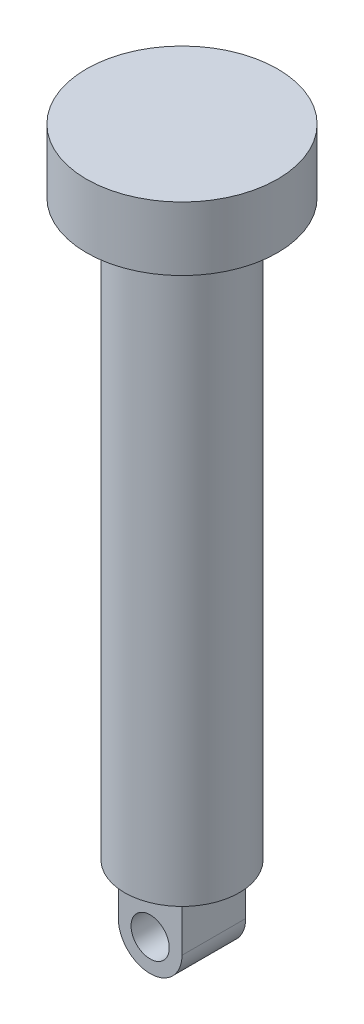
ISO-10303-21;
HEADER;
FILE_DESCRIPTION(('STEP AP214'),'2;1');
FILE_NAME('part.step','',(''),(''),'','','');
FILE_SCHEMA(('AUTOMOTIVE_DESIGN { 1 0 10303 214 1 1 1 1 }'));
ENDSEC;
DATA;
#1=APPLICATION_CONTEXT('core data for automotive mechanical design processes');
#2=APPLICATION_PROTOCOL_DEFINITION('international standard','automotive_design',2000,#1);
#3=PRODUCT_CONTEXT('',#1,'mechanical');
#4=PRODUCT('Part','Part','',(#3));
#5=PRODUCT_RELATED_PRODUCT_CATEGORY('part','',(#4));
#6=PRODUCT_DEFINITION_FORMATION('','',#4);
#7=PRODUCT_DEFINITION_CONTEXT('part definition',#1,'design');
#8=PRODUCT_DEFINITION('design','',#6,#7);
#9=PRODUCT_DEFINITION_SHAPE('','',#8);
#10=(LENGTH_UNIT() NAMED_UNIT(*) SI_UNIT(.MILLI.,.METRE.));
#11=(NAMED_UNIT(*) PLANE_ANGLE_UNIT() SI_UNIT($,.RADIAN.));
#12=(NAMED_UNIT(*) SI_UNIT($,.STERADIAN.) SOLID_ANGLE_UNIT());
#13=UNCERTAINTY_MEASURE_WITH_UNIT(LENGTH_MEASURE(1.E-05),#10,'distance_accuracy_value','');
#14=(GEOMETRIC_REPRESENTATION_CONTEXT(3) GLOBAL_UNCERTAINTY_ASSIGNED_CONTEXT((#13)) GLOBAL_UNIT_ASSIGNED_CONTEXT((#10,
#11,#12)) REPRESENTATION_CONTEXT('',''));
#15=CARTESIAN_POINT('',(0.,0.,0.));
#16=DIRECTION('',(0.,0.,1.));
#17=DIRECTION('',(1.,0.,0.));
#18=AXIS2_PLACEMENT_3D('',#15,#16,#17);
#19=CARTESIAN_POINT('',(0.,-90.,0.));
#20=DIRECTION('',(0.,1.,0.));
#21=DIRECTION('',(0.,0.,1.));
#22=AXIS2_PLACEMENT_3D('',#19,#20,#21);
#23=PLANE('',#22);
#24=CARTESIAN_POINT('',(0.,-90.,0.));
#25=DIRECTION('',(0.,1.,0.));
#26=DIRECTION('',(0.,0.,1.));
#27=AXIS2_PLACEMENT_3D('',#24,#25,#26);
#28=CIRCLE('',#27,9.);
#29=CARTESIAN_POINT('',(0.,-90.,9.));
#30=VERTEX_POINT('',#29);
#31=EDGE_CURVE('E120',#30,#30,#28,.T.);
#32=ORIENTED_EDGE('',*,*,#31,.F.);
#33=EDGE_LOOP('',(#32));
#34=FACE_BOUND('',#33,.T.);
#35=DIRECTION('',(0.,0.,-1.));
#36=VECTOR('',#35,1.);
#37=CARTESIAN_POINT('',(-5.,-90.,5.));
#38=LINE('',#37,#36);
#39=CARTESIAN_POINT('',(-5.,-90.,5.));
#40=VERTEX_POINT('',#39);
#41=CARTESIAN_POINT('',(-5.,-90.,-5.));
#42=VERTEX_POINT('',#41);
#43=EDGE_CURVE('E56',#40,#42,#38,.T.);
#44=ORIENTED_EDGE('',*,*,#43,.F.);
#45=DIRECTION('',(-1.,0.,0.));
#46=VECTOR('',#45,1.);
#47=CARTESIAN_POINT('',(-5.,-90.,5.));
#48=LINE('',#47,#46);
#49=CARTESIAN_POINT('',(5.,-90.,5.));
#50=VERTEX_POINT('',#49);
#51=EDGE_CURVE('E88',#50,#40,#48,.T.);
#52=ORIENTED_EDGE('',*,*,#51,.F.);
#53=DIRECTION('',(0.,0.,-1.));
#54=VECTOR('',#53,1.);
#55=CARTESIAN_POINT('',(5.,-90.,5.));
#56=LINE('',#55,#54);
#57=CARTESIAN_POINT('',(5.,-90.,-5.));
#58=VERTEX_POINT('',#57);
#59=EDGE_CURVE('E104',#50,#58,#56,.T.);
#60=ORIENTED_EDGE('',*,*,#59,.T.);
#61=DIRECTION('',(-1.,0.,0.));
#62=VECTOR('',#61,1.);
#63=CARTESIAN_POINT('',(-5.,-90.,-5.));
#64=LINE('',#63,#62);
#65=EDGE_CURVE('E61',#58,#42,#64,.T.);
#66=ORIENTED_EDGE('',*,*,#65,.T.);
#67=EDGE_LOOP('',(#44,#52,#60,#66));
#68=FACE_BOUND('',#67,.T.);
#69=ADVANCED_FACE('F41',(#34,#68),#23,.F.);
#70=CARTESIAN_POINT('',(0.,10.,0.));
#71=DIRECTION('',(0.,-1.,0.));
#72=DIRECTION('',(0.,0.,-1.));
#73=AXIS2_PLACEMENT_3D('',#70,#71,#72);
#74=CYLINDRICAL_SURFACE('',#73,15.);
#75=CARTESIAN_POINT('',(0.,10.,0.));
#76=DIRECTION('',(0.,1.,0.));
#77=DIRECTION('',(0.,0.,1.));
#78=AXIS2_PLACEMENT_3D('',#75,#76,#77);
#79=CIRCLE('',#78,15.);
#80=CARTESIAN_POINT('',(0.,10.,15.));
#81=VERTEX_POINT('',#80);
#82=EDGE_CURVE('E11',#81,#81,#79,.T.);
#83=ORIENTED_EDGE('',*,*,#82,.F.);
#84=EDGE_LOOP('',(#83));
#85=FACE_BOUND('',#84,.T.);
#86=CARTESIAN_POINT('',(0.,0.,0.));
#87=DIRECTION('',(0.,1.,0.));
#88=DIRECTION('',(0.,0.,1.));
#89=AXIS2_PLACEMENT_3D('',#86,#87,#88);
#90=CIRCLE('',#89,15.);
#91=CARTESIAN_POINT('',(0.,0.,15.));
#92=VERTEX_POINT('',#91);
#93=EDGE_CURVE('E45',#92,#92,#90,.T.);
#94=ORIENTED_EDGE('',*,*,#93,.T.);
#95=EDGE_LOOP('',(#94));
#96=FACE_BOUND('',#95,.T.);
#97=ADVANCED_FACE('F43',(#85,#96),#74,.T.);
#98=CARTESIAN_POINT('',(0.,10.,0.));
#99=DIRECTION('',(0.,1.,0.));
#100=DIRECTION('',(0.,0.,1.));
#101=AXIS2_PLACEMENT_3D('',#98,#99,#100);
#102=PLANE('',#101);
#103=ORIENTED_EDGE('',*,*,#82,.T.);
#104=EDGE_LOOP('',(#103));
#105=FACE_BOUND('',#104,.T.);
#106=ADVANCED_FACE('F140',(#105),#102,.T.);
#107=CARTESIAN_POINT('',(0.,0.,0.));
#108=DIRECTION('',(0.,1.,0.));
#109=DIRECTION('',(0.,0.,1.));
#110=AXIS2_PLACEMENT_3D('',#107,#108,#109);
#111=PLANE('',#110);
#112=CARTESIAN_POINT('',(0.,0.,0.));
#113=DIRECTION('',(0.,1.,0.));
#114=DIRECTION('',(0.,0.,1.));
#115=AXIS2_PLACEMENT_3D('',#112,#113,#114);
#116=CIRCLE('',#115,9.);
#117=CARTESIAN_POINT('',(0.,0.,9.));
#118=VERTEX_POINT('',#117);
#119=EDGE_CURVE('E119',#118,#118,#116,.T.);
#120=ORIENTED_EDGE('',*,*,#119,.T.);
#121=EDGE_LOOP('',(#120));
#122=FACE_BOUND('',#121,.T.);
#123=ORIENTED_EDGE('',*,*,#93,.F.);
#124=EDGE_LOOP('',(#123));
#125=FACE_BOUND('',#124,.T.);
#126=ADVANCED_FACE('F126',(#122,#125),#111,.F.);
#127=CARTESIAN_POINT('',(0.,-90.,0.));
#128=DIRECTION('',(0.,1.,0.));
#129=DIRECTION('',(0.,0.,1.));
#130=AXIS2_PLACEMENT_3D('',#127,#128,#129);
#131=CYLINDRICAL_SURFACE('',#130,9.);
#132=CARTESIAN_POINT('',(0.,-90.,9.));
#133=CARTESIAN_POINT('',(0.,-89.0625,9.));
#134=CARTESIAN_POINT('',(0.,-88.125,9.));
#135=CARTESIAN_POINT('',(0.,-86.25,9.));
#136=CARTESIAN_POINT('',(0.,-85.3125,9.));
#137=CARTESIAN_POINT('',(0.,-83.4375,9.));
#138=CARTESIAN_POINT('',(0.,-82.5,9.));
#139=CARTESIAN_POINT('',(0.,-80.625,9.));
#140=CARTESIAN_POINT('',(0.,-79.6875,9.));
#141=CARTESIAN_POINT('',(0.,-77.8125,9.));
#142=CARTESIAN_POINT('',(0.,-76.875,9.));
#143=CARTESIAN_POINT('',(0.,-75.,9.));
#144=CARTESIAN_POINT('',(0.,-74.0625,9.));
#145=CARTESIAN_POINT('',(0.,-72.1875,9.));
#146=CARTESIAN_POINT('',(0.,-71.25,9.));
#147=CARTESIAN_POINT('',(0.,-69.375,9.));
#148=CARTESIAN_POINT('',(0.,-68.4375,9.));
#149=CARTESIAN_POINT('',(0.,-66.5625,9.));
#150=CARTESIAN_POINT('',(0.,-65.625,9.));
#151=CARTESIAN_POINT('',(0.,-63.75,9.));
#152=CARTESIAN_POINT('',(0.,-62.8125,9.));
#153=CARTESIAN_POINT('',(0.,-60.9375,9.));
#154=CARTESIAN_POINT('',(0.,-60.,9.));
#155=CARTESIAN_POINT('',(0.,-58.125,9.));
#156=CARTESIAN_POINT('',(0.,-57.1875,9.));
#157=CARTESIAN_POINT('',(0.,-55.3125,9.));
#158=CARTESIAN_POINT('',(0.,-54.375,9.));
#159=CARTESIAN_POINT('',(0.,-52.5,9.));
#160=CARTESIAN_POINT('',(0.,-51.5625,9.));
#161=CARTESIAN_POINT('',(0.,-49.6875,9.));
#162=CARTESIAN_POINT('',(0.,-48.75,9.));
#163=CARTESIAN_POINT('',(0.,-46.875,9.));
#164=CARTESIAN_POINT('',(0.,-45.9375,9.));
#165=CARTESIAN_POINT('',(0.,-44.0625,9.));
#166=CARTESIAN_POINT('',(0.,-43.125,9.));
#167=CARTESIAN_POINT('',(0.,-41.25,9.));
#168=CARTESIAN_POINT('',(0.,-40.3125,9.));
#169=CARTESIAN_POINT('',(0.,-38.4375,9.));
#170=CARTESIAN_POINT('',(0.,-37.5,9.));
#171=CARTESIAN_POINT('',(0.,-35.625,9.));
#172=CARTESIAN_POINT('',(0.,-34.6875,9.));
#173=CARTESIAN_POINT('',(0.,-32.8125,9.));
#174=CARTESIAN_POINT('',(0.,-31.875,9.));
#175=CARTESIAN_POINT('',(0.,-30.,9.));
#176=CARTESIAN_POINT('',(0.,-29.0625,9.));
#177=CARTESIAN_POINT('',(0.,-27.1875,9.));
#178=CARTESIAN_POINT('',(0.,-26.25,9.));
#179=CARTESIAN_POINT('',(0.,-24.375,9.));
#180=CARTESIAN_POINT('',(0.,-23.4375,9.));
#181=CARTESIAN_POINT('',(0.,-21.5625,9.));
#182=CARTESIAN_POINT('',(0.,-20.625,9.));
#183=CARTESIAN_POINT('',(0.,-18.75,9.));
#184=CARTESIAN_POINT('',(0.,-17.8125,9.));
#185=CARTESIAN_POINT('',(0.,-15.9375,9.));
#186=CARTESIAN_POINT('',(0.,-15.,9.));
#187=CARTESIAN_POINT('',(0.,-13.125,9.));
#188=CARTESIAN_POINT('',(0.,-12.1875,9.));
#189=CARTESIAN_POINT('',(0.,-10.3125,9.));
#190=CARTESIAN_POINT('',(0.,-9.37500000000001,9.));
#191=CARTESIAN_POINT('',(0.,-7.50000000000002,9.));
#192=CARTESIAN_POINT('',(0.,-6.56250000000002,9.));
#193=CARTESIAN_POINT('',(0.,-4.68750000000002,9.));
#194=CARTESIAN_POINT('',(0.,-3.75000000000001,9.));
#195=CARTESIAN_POINT('',(0.,-1.87500000000001,9.));
#196=CARTESIAN_POINT('',(0.,-0.937500000000014,9.));
#197=CARTESIAN_POINT('',(0.,0.,9.));
#198=B_SPLINE_CURVE_WITH_KNOTS('',3,(#132,#133,#134,#135,#136,#137,#138,#139,#140,#141,#142,
#143,#144,#145,#146,#147,#148,#149,#150,#151,#152,#153,#154,#155,#156,#157,#158,#159,#160,#161,
#162,#163,#164,#165,#166,#167,#168,#169,#170,#171,#172,#173,#174,#175,#176,#177,#178,#179,#180,
#181,#182,#183,#184,#185,#186,#187,#188,#189,#190,#191,#192,#193,#194,#195,#196,#197),
.UNSPECIFIED.,.F.,.F.,(4,2,2,2,2,2,2,2,2,2,2,2,2,2,2,2,2,2,2,2,2,2,2,2,2,2,2,2,2,2,2,2,4),(0.,
2.8125,5.62499999999999,8.43749999999999,11.25,14.0625,16.875,19.6875,22.5,25.3125,28.125,
30.9375,33.75,36.5625,39.375,42.1875,45.,47.8125,50.625,53.4375,56.25,59.0625,61.875,64.6875,
67.5,70.3125,73.125,75.9375,78.75,81.5625,84.375,87.1875,90.),.UNSPECIFIED.);
#199=EDGE_CURVE('BSEAM129',#30,#118,#198,.T.);
#200=ORIENTED_EDGE('',*,*,#31,.T.);
#201=ORIENTED_EDGE('',*,*,#119,.F.);
#202=ORIENTED_EDGE('',*,*,#199,.T.);
#203=ORIENTED_EDGE('',*,*,#199,.F.);
#204=EDGE_LOOP('',(#200,#202,#201,#203));
#205=FACE_BOUND('',#204,.T.);
#206=ADVANCED_FACE('F129',(#205),#131,.T.);
#207=CARTESIAN_POINT('',(0.,-98.,5.));
#208=DIRECTION('',(0.,0.,1.));
#209=DIRECTION('',(1.,0.,0.));
#210=AXIS2_PLACEMENT_3D('',#207,#208,#209);
#211=PLANE('',#210);
#212=ORIENTED_EDGE('',*,*,#51,.T.);
#213=DIRECTION('',(0.,-1.,0.));
#214=VECTOR('',#213,1.);
#215=CARTESIAN_POINT('',(-5.,-90.,5.));
#216=LINE('',#215,#214);
#217=CARTESIAN_POINT('',(-5.,-98.,5.));
#218=VERTEX_POINT('',#217);
#219=EDGE_CURVE('E80',#40,#218,#216,.T.);
#220=ORIENTED_EDGE('',*,*,#219,.T.);
#221=CARTESIAN_POINT('',(0.,-98.,5.));
#222=DIRECTION('',(0.,0.,1.));
#223=DIRECTION('',(1.,0.,0.));
#224=AXIS2_PLACEMENT_3D('',#221,#222,#223);
#225=CIRCLE('',#224,5.);
#226=CARTESIAN_POINT('',(5.,-98.,5.));
#227=VERTEX_POINT('',#226);
#228=EDGE_CURVE('E86',#218,#227,#225,.T.);
#229=ORIENTED_EDGE('',*,*,#228,.T.);
#230=DIRECTION('',(0.,1.,0.));
#231=VECTOR('',#230,1.);
#232=CARTESIAN_POINT('',(5.,-98.,5.));
#233=LINE('',#232,#231);
#234=EDGE_CURVE('E102',#227,#50,#233,.T.);
#235=ORIENTED_EDGE('',*,*,#234,.T.);
#236=EDGE_LOOP('',(#212,#220,#229,#235));
#237=FACE_BOUND('',#236,.T.);
#238=CARTESIAN_POINT('',(0.,-98.,5.));
#239=DIRECTION('',(0.,0.,1.));
#240=DIRECTION('',(1.,0.,0.));
#241=AXIS2_PLACEMENT_3D('',#238,#239,#240);
#242=CIRCLE('',#241,3.);
#243=CARTESIAN_POINT('',(3.,-98.,5.));
#244=VERTEX_POINT('',#243);
#245=EDGE_CURVE('E109',#244,#244,#242,.T.);
#246=ORIENTED_EDGE('',*,*,#245,.F.);
#247=EDGE_LOOP('',(#246));
#248=FACE_BOUND('',#247,.T.);
#249=ADVANCED_FACE('F82',(#237,#248),#211,.T.);
#250=CARTESIAN_POINT('',(0.,-98.,-5.));
#251=DIRECTION('',(0.,0.,1.));
#252=DIRECTION('',(1.,0.,0.));
#253=AXIS2_PLACEMENT_3D('',#250,#251,#252);
#254=PLANE('',#253);
#255=ORIENTED_EDGE('',*,*,#65,.F.);
#256=DIRECTION('',(0.,1.,0.));
#257=VECTOR('',#256,1.);
#258=CARTESIAN_POINT('',(5.,-98.,-5.));
#259=LINE('',#258,#257);
#260=CARTESIAN_POINT('',(5.,-98.,-5.));
#261=VERTEX_POINT('',#260);
#262=EDGE_CURVE('E113',#261,#58,#259,.T.);
#263=ORIENTED_EDGE('',*,*,#262,.F.);
#264=CARTESIAN_POINT('',(0.,-98.,-5.));
#265=DIRECTION('',(0.,0.,1.));
#266=DIRECTION('',(1.,0.,0.));
#267=AXIS2_PLACEMENT_3D('',#264,#265,#266);
#268=CIRCLE('',#267,5.);
#269=CARTESIAN_POINT('',(-5.,-98.,-5.));
#270=VERTEX_POINT('',#269);
#271=EDGE_CURVE('E111',#270,#261,#268,.T.);
#272=ORIENTED_EDGE('',*,*,#271,.F.);
#273=DIRECTION('',(0.,-1.,0.));
#274=VECTOR('',#273,1.);
#275=CARTESIAN_POINT('',(-5.,-90.,-5.));
#276=LINE('',#275,#274);
#277=EDGE_CURVE('E94',#42,#270,#276,.T.);
#278=ORIENTED_EDGE('',*,*,#277,.F.);
#279=EDGE_LOOP('',(#255,#263,#272,#278));
#280=FACE_BOUND('',#279,.T.);
#281=CARTESIAN_POINT('',(0.,-98.,-5.));
#282=DIRECTION('',(0.,0.,1.));
#283=DIRECTION('',(1.,0.,0.));
#284=AXIS2_PLACEMENT_3D('',#281,#282,#283);
#285=CIRCLE('',#284,3.);
#286=CARTESIAN_POINT('',(3.,-98.,-5.));
#287=VERTEX_POINT('',#286);
#288=EDGE_CURVE('E171',#287,#287,#285,.T.);
#289=ORIENTED_EDGE('',*,*,#288,.T.);
#290=EDGE_LOOP('',(#289));
#291=FACE_BOUND('',#290,.T.);
#292=ADVANCED_FACE('F138',(#280,#291),#254,.F.);
#293=CARTESIAN_POINT('',(-5.,-90.,5.));
#294=DIRECTION('',(1.,0.,0.));
#295=DIRECTION('',(0.,1.,0.));
#296=AXIS2_PLACEMENT_3D('',#293,#294,#295);
#297=PLANE('',#296);
#298=ORIENTED_EDGE('',*,*,#277,.T.);
#299=DIRECTION('',(0.,0.,-1.));
#300=VECTOR('',#299,1.);
#301=CARTESIAN_POINT('',(-5.,-98.,5.));
#302=LINE('',#301,#300);
#303=EDGE_CURVE('E92',#218,#270,#302,.T.);
#304=ORIENTED_EDGE('',*,*,#303,.F.);
#305=ORIENTED_EDGE('',*,*,#219,.F.);
#306=ORIENTED_EDGE('',*,*,#43,.T.);
#307=EDGE_LOOP('',(#298,#304,#305,#306));
#308=FACE_BOUND('',#307,.T.);
#309=ADVANCED_FACE('F93',(#308),#297,.F.);
#310=CARTESIAN_POINT('',(0.,-98.,5.));
#311=DIRECTION('',(0.,0.,-1.));
#312=DIRECTION('',(-1.,0.,0.));
#313=AXIS2_PLACEMENT_3D('',#310,#311,#312);
#314=CYLINDRICAL_SURFACE('',#313,5.);
#315=ORIENTED_EDGE('',*,*,#271,.T.);
#316=DIRECTION('',(0.,0.,-1.));
#317=VECTOR('',#316,1.);
#318=CARTESIAN_POINT('',(5.,-98.,5.));
#319=LINE('',#318,#317);
#320=EDGE_CURVE('E97',#227,#261,#319,.T.);
#321=ORIENTED_EDGE('',*,*,#320,.F.);
#322=ORIENTED_EDGE('',*,*,#228,.F.);
#323=ORIENTED_EDGE('',*,*,#303,.T.);
#324=EDGE_LOOP('',(#315,#321,#322,#323));
#325=FACE_BOUND('',#324,.T.);
#326=ADVANCED_FACE('F99',(#325),#314,.T.);
#327=CARTESIAN_POINT('',(5.,-98.,5.));
#328=DIRECTION('',(-1.,0.,0.));
#329=DIRECTION('',(0.,0.,1.));
#330=AXIS2_PLACEMENT_3D('',#327,#328,#329);
#331=PLANE('',#330);
#332=ORIENTED_EDGE('',*,*,#262,.T.);
#333=ORIENTED_EDGE('',*,*,#59,.F.);
#334=ORIENTED_EDGE('',*,*,#234,.F.);
#335=ORIENTED_EDGE('',*,*,#320,.T.);
#336=EDGE_LOOP('',(#332,#333,#334,#335));
#337=FACE_BOUND('',#336,.T.);
#338=ADVANCED_FACE('F154',(#337),#331,.F.);
#339=CARTESIAN_POINT('',(0.,-98.,5.));
#340=DIRECTION('',(0.,0.,-1.));
#341=DIRECTION('',(-1.,0.,0.));
#342=AXIS2_PLACEMENT_3D('',#339,#340,#341);
#343=CYLINDRICAL_SURFACE('',#342,3.);
#344=ORIENTED_EDGE('',*,*,#245,.T.);
#345=EDGE_LOOP('',(#344));
#346=FACE_BOUND('',#345,.T.);
#347=ORIENTED_EDGE('',*,*,#288,.F.);
#348=EDGE_LOOP('',(#347));
#349=FACE_BOUND('',#348,.T.);
#350=ADVANCED_FACE('F157',(#346,#349),#343,.F.);
#351=CLOSED_SHELL('',(#69,#97,#106,#126,#206,#249,#292,#309,#326,#338,#350));
#352=MANIFOLD_SOLID_BREP('B2',#351);
#353=ADVANCED_BREP_SHAPE_REPRESENTATION('',(#18,#352),#14);
#354=SHAPE_DEFINITION_REPRESENTATION(#9,#353);
ENDSEC;
END-ISO-10303-21;
